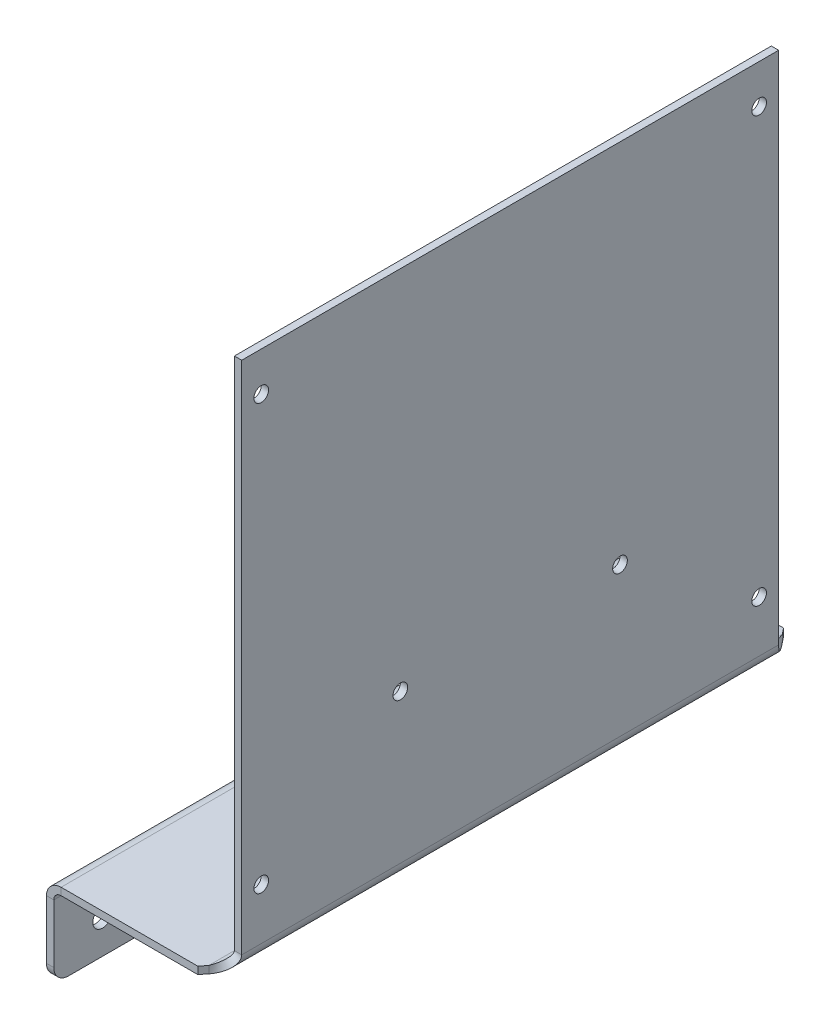
ISO-10303-21;
HEADER;
FILE_DESCRIPTION(('STEP AP214'),'2;1');
FILE_NAME('part.step','',(''),(''),'','','');
FILE_SCHEMA(('AUTOMOTIVE_DESIGN { 1 0 10303 214 1 1 1 1 }'));
ENDSEC;
DATA;
#1=APPLICATION_CONTEXT('core data for automotive mechanical design processes');
#2=APPLICATION_PROTOCOL_DEFINITION('international standard','automotive_design',2000,#1);
#3=PRODUCT_CONTEXT('',#1,'mechanical');
#4=PRODUCT('Part','Part','',(#3));
#5=PRODUCT_RELATED_PRODUCT_CATEGORY('part','',(#4));
#6=PRODUCT_DEFINITION_FORMATION('','',#4);
#7=PRODUCT_DEFINITION_CONTEXT('part definition',#1,'design');
#8=PRODUCT_DEFINITION('design','',#6,#7);
#9=PRODUCT_DEFINITION_SHAPE('','',#8);
#10=(LENGTH_UNIT() NAMED_UNIT(*) SI_UNIT(.MILLI.,.METRE.));
#11=(NAMED_UNIT(*) PLANE_ANGLE_UNIT() SI_UNIT($,.RADIAN.));
#12=(NAMED_UNIT(*) SI_UNIT($,.STERADIAN.) SOLID_ANGLE_UNIT());
#13=UNCERTAINTY_MEASURE_WITH_UNIT(LENGTH_MEASURE(1.E-05),#10,'distance_accuracy_value','');
#14=(GEOMETRIC_REPRESENTATION_CONTEXT(3) GLOBAL_UNCERTAINTY_ASSIGNED_CONTEXT((#13)) GLOBAL_UNIT_ASSIGNED_CONTEXT((#10,
#11,#12)) REPRESENTATION_CONTEXT('',''));
#15=CARTESIAN_POINT('',(0.,0.,0.));
#16=DIRECTION('',(0.,0.,1.));
#17=DIRECTION('',(1.,0.,0.));
#18=AXIS2_PLACEMENT_3D('',#15,#16,#17);
#19=CARTESIAN_POINT('',(-1.49999999999999,-105.5,60.));
#20=DIRECTION('',(0.,0.,1.));
#21=DIRECTION('',(1.,0.,0.));
#22=AXIS2_PLACEMENT_3D('',#19,#20,#21);
#23=PLANE('',#22);
#24=DIRECTION('',(-1.,0.,0.));
#25=VECTOR('',#24,1.);
#26=CARTESIAN_POINT('',(0.,-108.5,60.));
#27=LINE('',#26,#25);
#28=CARTESIAN_POINT('',(-4.,-108.5,60.));
#29=VERTEX_POINT('',#28);
#30=CARTESIAN_POINT('',(-32.,-108.5,60.));
#31=VERTEX_POINT('',#30);
#32=EDGE_CURVE('E300',#29,#31,#27,.T.);
#33=ORIENTED_EDGE('',*,*,#32,.F.);
#34=DIRECTION('',(0.,-1.,0.));
#35=VECTOR('',#34,1.);
#36=CARTESIAN_POINT('',(-4.,-108.5,60.));
#37=LINE('',#36,#35);
#38=CARTESIAN_POINT('',(-4.,-107.,60.));
#39=VERTEX_POINT('',#38);
#40=EDGE_CURVE('E346',#29,#39,#37,.F.);
#41=ORIENTED_EDGE('',*,*,#40,.T.);
#42=DIRECTION('',(1.,0.,0.));
#43=VECTOR('',#42,1.);
#44=CARTESIAN_POINT('',(0.,-107.,60.));
#45=LINE('',#44,#43);
#46=CARTESIAN_POINT('',(-32.,-107.,60.));
#47=VERTEX_POINT('',#46);
#48=EDGE_CURVE('E302',#39,#47,#45,.F.);
#49=ORIENTED_EDGE('',*,*,#48,.T.);
#50=DIRECTION('',(0.,-1.,0.));
#51=VECTOR('',#50,1.);
#52=CARTESIAN_POINT('',(-32.,-107.,60.));
#53=LINE('',#52,#51);
#54=EDGE_CURVE('E212',#47,#31,#53,.T.);
#55=ORIENTED_EDGE('',*,*,#54,.T.);
#56=EDGE_LOOP('',(#33,#41,#49,#55));
#57=FACE_BOUND('',#56,.T.);
#58=ADVANCED_FACE('F39',(#57),#23,.T.);
#59=CARTESIAN_POINT('',(-35.,-110.,-60.));
#60=DIRECTION('',(0.,0.,-1.));
#61=DIRECTION('',(-1.,0.,0.));
#62=AXIS2_PLACEMENT_3D('',#59,#60,#61);
#63=PLANE('',#62);
#64=DIRECTION('',(1.,0.,0.));
#65=VECTOR('',#64,1.);
#66=CARTESIAN_POINT('',(0.,-107.,-60.));
#67=LINE('',#66,#65);
#68=CARTESIAN_POINT('',(-4.00000000000002,-107.,-60.));
#69=VERTEX_POINT('',#68);
#70=CARTESIAN_POINT('',(-32.,-107.,-60.));
#71=VERTEX_POINT('',#70);
#72=EDGE_CURVE('E292',#69,#71,#67,.F.);
#73=ORIENTED_EDGE('',*,*,#72,.F.);
#74=DIRECTION('',(0.,-1.,0.));
#75=VECTOR('',#74,1.);
#76=CARTESIAN_POINT('',(-4.,-108.5,-60.));
#77=LINE('',#76,#75);
#78=CARTESIAN_POINT('',(-4.,-108.5,-60.));
#79=VERTEX_POINT('',#78);
#80=EDGE_CURVE('E307',#79,#69,#77,.F.);
#81=ORIENTED_EDGE('',*,*,#80,.F.);
#82=DIRECTION('',(-1.,0.,0.));
#83=VECTOR('',#82,1.);
#84=CARTESIAN_POINT('',(0.,-108.5,-60.));
#85=LINE('',#84,#83);
#86=CARTESIAN_POINT('',(-32.,-108.5,-60.));
#87=VERTEX_POINT('',#86);
#88=EDGE_CURVE('E310',#79,#87,#85,.T.);
#89=ORIENTED_EDGE('',*,*,#88,.T.);
#90=DIRECTION('',(0.,1.,0.));
#91=VECTOR('',#90,1.);
#92=CARTESIAN_POINT('',(-32.,-108.5,-60.));
#93=LINE('',#92,#91);
#94=EDGE_CURVE('E209',#87,#71,#93,.T.);
#95=ORIENTED_EDGE('',*,*,#94,.T.);
#96=EDGE_LOOP('',(#73,#81,#89,#95));
#97=FACE_BOUND('',#96,.T.);
#98=ADVANCED_FACE('F389',(#97),#63,.T.);
#99=CARTESIAN_POINT('',(0.,-108.5,60.));
#100=DIRECTION('',(0.,-1.,0.));
#101=DIRECTION('',(0.,0.,-1.));
#102=AXIS2_PLACEMENT_3D('',#99,#100,#101);
#103=PLANE('',#102);
#104=DIRECTION('',(0.,0.,-1.));
#105=VECTOR('',#104,1.);
#106=CARTESIAN_POINT('',(-2.99999999999999,-108.5,60.));
#107=LINE('',#106,#105);
#108=CARTESIAN_POINT('',(-2.99999999999999,-108.5,58.75));
#109=VERTEX_POINT('',#108);
#110=CARTESIAN_POINT('',(-2.99999999999999,-108.5,-58.75));
#111=VERTEX_POINT('',#110);
#112=EDGE_CURVE('E190',#109,#111,#107,.T.);
#113=ORIENTED_EDGE('',*,*,#112,.F.);
#114=DIRECTION('',(0.624695047554425,0.,-0.78086880944303));
#115=VECTOR('',#114,1.);
#116=CARTESIAN_POINT('',(-2.4390243902439,-108.5,58.0487804878049));
#117=LINE('',#116,#115);
#118=EDGE_CURVE('E347',#29,#109,#117,.T.);
#119=ORIENTED_EDGE('',*,*,#118,.F.);
#120=ORIENTED_EDGE('',*,*,#32,.T.);
#121=DIRECTION('',(0.,0.,-1.));
#122=VECTOR('',#121,1.);
#123=CARTESIAN_POINT('',(-32.,-108.5,60.));
#124=LINE('',#123,#122);
#125=EDGE_CURVE('E192',#31,#87,#124,.T.);
#126=ORIENTED_EDGE('',*,*,#125,.T.);
#127=ORIENTED_EDGE('',*,*,#88,.F.);
#128=DIRECTION('',(-0.624695047554425,0.,-0.78086880944303));
#129=VECTOR('',#128,1.);
#130=CARTESIAN_POINT('',(56.0975609756098,-108.5,15.1219512195122));
#131=LINE('',#130,#129);
#132=EDGE_CURVE('E337',#111,#79,#131,.T.);
#133=ORIENTED_EDGE('',*,*,#132,.F.);
#134=EDGE_LOOP('',(#113,#119,#120,#126,#127,#133));
#135=FACE_BOUND('',#134,.T.);
#136=ADVANCED_FACE('F384',(#135),#103,.T.);
#137=CARTESIAN_POINT('',(-2.99999999999999,-105.5,60.));
#138=DIRECTION('',(0.,0.,-1.));
#139=DIRECTION('',(-1.,0.,0.));
#140=AXIS2_PLACEMENT_3D('',#137,#138,#139);
#141=CYLINDRICAL_SURFACE('',#140,3.);
#142=DIRECTION('',(0.,0.,-1.));
#143=VECTOR('',#142,1.);
#144=CARTESIAN_POINT('',(0.,-105.5,60.));
#145=LINE('',#144,#143);
#146=CARTESIAN_POINT('',(0.,-105.5,55.));
#147=VERTEX_POINT('',#146);
#148=CARTESIAN_POINT('',(0.,-105.5,-55.));
#149=VERTEX_POINT('',#148);
#150=EDGE_CURVE('E183',#147,#149,#145,.T.);
#151=ORIENTED_EDGE('',*,*,#150,.F.);
#152=CARTESIAN_POINT('',(-2.99999999999999,-105.5,58.75));
#153=DIRECTION('',(-0.78086880944303,0.,-0.624695047554425));
#154=DIRECTION('',(0.624695047554425,0.,-0.78086880944303));
#155=AXIS2_PLACEMENT_3D('',#152,#153,#154);
#156=ELLIPSE('',#155,4.80234317807463,3.);
#157=EDGE_CURVE('E154',#109,#147,#156,.F.);
#158=ORIENTED_EDGE('',*,*,#157,.F.);
#159=ORIENTED_EDGE('',*,*,#112,.T.);
#160=CARTESIAN_POINT('',(-2.99999999999999,-105.5,-58.75));
#161=DIRECTION('',(-0.78086880944303,0.,0.624695047554425));
#162=DIRECTION('',(-0.624695047554425,0.,-0.78086880944303));
#163=AXIS2_PLACEMENT_3D('',#160,#161,#162);
#164=ELLIPSE('',#163,4.80234317807463,3.);
#165=EDGE_CURVE('E189',#149,#111,#164,.F.);
#166=ORIENTED_EDGE('',*,*,#165,.F.);
#167=EDGE_LOOP('',(#151,#158,#159,#166));
#168=FACE_BOUND('',#167,.T.);
#169=ADVANCED_FACE('F188',(#168),#141,.T.);
#170=CARTESIAN_POINT('',(0.,0.,60.));
#171=DIRECTION('',(1.,0.,0.));
#172=DIRECTION('',(0.,1.,0.));
#173=AXIS2_PLACEMENT_3D('',#170,#171,#172);
#174=PLANE('',#173);
#175=CARTESIAN_POINT('',(0.,-8.,51.));
#176=DIRECTION('',(1.,0.,0.));
#177=DIRECTION('',(0.,1.,0.));
#178=AXIS2_PLACEMENT_3D('',#175,#176,#177);
#179=CIRCLE('',#178,1.5);
#180=CARTESIAN_POINT('',(0.,-6.5,51.));
#181=VERTEX_POINT('',#180);
#182=EDGE_CURVE('E806',#181,#181,#179,.T.);
#183=ORIENTED_EDGE('',*,*,#182,.F.);
#184=EDGE_LOOP('',(#183));
#185=FACE_BOUND('',#184,.T.);
#186=CARTESIAN_POINT('',(0.,-75.,22.5));
#187=DIRECTION('',(1.,0.,0.));
#188=DIRECTION('',(0.,1.,0.));
#189=AXIS2_PLACEMENT_3D('',#186,#187,#188);
#190=CIRCLE('',#189,1.5);
#191=CARTESIAN_POINT('',(0.,-73.5,22.5));
#192=VERTEX_POINT('',#191);
#193=EDGE_CURVE('E802',#192,#192,#190,.T.);
#194=ORIENTED_EDGE('',*,*,#193,.F.);
#195=EDGE_LOOP('',(#194));
#196=FACE_BOUND('',#195,.T.);
#197=CARTESIAN_POINT('',(0.,-95.,51.));
#198=DIRECTION('',(1.,0.,0.));
#199=DIRECTION('',(0.,1.,0.));
#200=AXIS2_PLACEMENT_3D('',#197,#198,#199);
#201=CIRCLE('',#200,1.5);
#202=CARTESIAN_POINT('',(0.,-93.5,51.));
#203=VERTEX_POINT('',#202);
#204=EDGE_CURVE('E789',#203,#203,#201,.T.);
#205=ORIENTED_EDGE('',*,*,#204,.F.);
#206=EDGE_LOOP('',(#205));
#207=FACE_BOUND('',#206,.T.);
#208=CARTESIAN_POINT('',(0.,-95.,-51.));
#209=DIRECTION('',(1.,0.,0.));
#210=DIRECTION('',(0.,-1.,0.));
#211=AXIS2_PLACEMENT_3D('',#208,#209,#210);
#212=CIRCLE('',#211,1.5);
#213=CARTESIAN_POINT('',(0.,-96.5,-51.));
#214=VERTEX_POINT('',#213);
#215=EDGE_CURVE('E803',#214,#214,#212,.T.);
#216=ORIENTED_EDGE('',*,*,#215,.F.);
#217=EDGE_LOOP('',(#216));
#218=FACE_BOUND('',#217,.T.);
#219=CARTESIAN_POINT('',(0.,-75.,-22.5));
#220=DIRECTION('',(1.,0.,0.));
#221=DIRECTION('',(0.,-1.,0.));
#222=AXIS2_PLACEMENT_3D('',#219,#220,#221);
#223=CIRCLE('',#222,1.5);
#224=CARTESIAN_POINT('',(0.,-76.5,-22.5));
#225=VERTEX_POINT('',#224);
#226=EDGE_CURVE('E809',#225,#225,#223,.T.);
#227=ORIENTED_EDGE('',*,*,#226,.F.);
#228=EDGE_LOOP('',(#227));
#229=FACE_BOUND('',#228,.T.);
#230=CARTESIAN_POINT('',(0.,-8.,-51.));
#231=DIRECTION('',(1.,0.,0.));
#232=DIRECTION('',(0.,-1.,0.));
#233=AXIS2_PLACEMENT_3D('',#230,#231,#232);
#234=CIRCLE('',#233,1.5);
#235=CARTESIAN_POINT('',(0.,-9.50000000000001,-51.));
#236=VERTEX_POINT('',#235);
#237=EDGE_CURVE('E814',#236,#236,#234,.T.);
#238=ORIENTED_EDGE('',*,*,#237,.F.);
#239=EDGE_LOOP('',(#238));
#240=FACE_BOUND('',#239,.T.);
#241=DIRECTION('',(0.,0.,-1.));
#242=VECTOR('',#241,1.);
#243=CARTESIAN_POINT('',(0.,0.,60.));
#244=LINE('',#243,#242);
#245=CARTESIAN_POINT('',(0.,0.,55.));
#246=VERTEX_POINT('',#245);
#247=CARTESIAN_POINT('',(0.,0.,-55.));
#248=VERTEX_POINT('',#247);
#249=EDGE_CURVE('E185',#246,#248,#244,.T.);
#250=ORIENTED_EDGE('',*,*,#249,.F.);
#251=DIRECTION('',(0.,1.,0.));
#252=VECTOR('',#251,1.);
#253=CARTESIAN_POINT('',(0.,-125.,55.));
#254=LINE('',#253,#252);
#255=EDGE_CURVE('E172',#147,#246,#254,.T.);
#256=ORIENTED_EDGE('',*,*,#255,.F.);
#257=ORIENTED_EDGE('',*,*,#150,.T.);
#258=DIRECTION('',(0.,1.,0.));
#259=VECTOR('',#258,1.);
#260=CARTESIAN_POINT('',(0.,-125.,-55.));
#261=LINE('',#260,#259);
#262=EDGE_CURVE('E339',#149,#248,#261,.T.);
#263=ORIENTED_EDGE('',*,*,#262,.T.);
#264=EDGE_LOOP('',(#250,#256,#257,#263));
#265=FACE_BOUND('',#264,.T.);
#266=ADVANCED_FACE('F181',(#185,#196,#207,#218,#229,#240,#265),#174,.T.);
#267=CARTESIAN_POINT('',(-1.5,0.,60.));
#268=DIRECTION('',(0.,1.,0.));
#269=DIRECTION('',(-1.,0.,0.));
#270=AXIS2_PLACEMENT_3D('',#267,#268,#269);
#271=PLANE('',#270);
#272=DIRECTION('',(0.,0.,-1.));
#273=VECTOR('',#272,1.);
#274=CARTESIAN_POINT('',(-1.5,0.,60.));
#275=LINE('',#274,#273);
#276=CARTESIAN_POINT('',(-1.5,0.,55.));
#277=VERTEX_POINT('',#276);
#278=CARTESIAN_POINT('',(-1.5,0.,-55.));
#279=VERTEX_POINT('',#278);
#280=EDGE_CURVE('E194',#277,#279,#275,.T.);
#281=ORIENTED_EDGE('',*,*,#280,.F.);
#282=DIRECTION('',(1.,0.,0.));
#283=VECTOR('',#282,1.);
#284=CARTESIAN_POINT('',(0.,0.,55.));
#285=LINE('',#284,#283);
#286=EDGE_CURVE('E176',#246,#277,#285,.F.);
#287=ORIENTED_EDGE('',*,*,#286,.F.);
#288=ORIENTED_EDGE('',*,*,#249,.T.);
#289=DIRECTION('',(1.,0.,0.));
#290=VECTOR('',#289,1.);
#291=CARTESIAN_POINT('',(0.,0.,-55.));
#292=LINE('',#291,#290);
#293=EDGE_CURVE('E332',#248,#279,#292,.F.);
#294=ORIENTED_EDGE('',*,*,#293,.T.);
#295=EDGE_LOOP('',(#281,#287,#288,#294));
#296=FACE_BOUND('',#295,.T.);
#297=ADVANCED_FACE('F331',(#296),#271,.T.);
#298=CARTESIAN_POINT('',(-1.5,0.,60.));
#299=DIRECTION('',(1.,0.,0.));
#300=DIRECTION('',(0.,1.,0.));
#301=AXIS2_PLACEMENT_3D('',#298,#299,#300);
#302=PLANE('',#301);
#303=CARTESIAN_POINT('',(-1.5,-8.,51.));
#304=DIRECTION('',(1.,0.,0.));
#305=DIRECTION('',(0.,1.,0.));
#306=AXIS2_PLACEMENT_3D('',#303,#304,#305);
#307=CIRCLE('',#306,1.5);
#308=CARTESIAN_POINT('',(-1.5,-6.5,51.));
#309=VERTEX_POINT('',#308);
#310=EDGE_CURVE('E167',#309,#309,#307,.T.);
#311=ORIENTED_EDGE('',*,*,#310,.T.);
#312=EDGE_LOOP('',(#311));
#313=FACE_BOUND('',#312,.T.);
#314=CARTESIAN_POINT('',(-1.49999999999999,-75.,22.5));
#315=DIRECTION('',(1.,0.,0.));
#316=DIRECTION('',(0.,1.,0.));
#317=AXIS2_PLACEMENT_3D('',#314,#315,#316);
#318=CIRCLE('',#317,1.5);
#319=CARTESIAN_POINT('',(-1.49999999999999,-73.5,22.5));
#320=VERTEX_POINT('',#319);
#321=EDGE_CURVE('E240',#320,#320,#318,.T.);
#322=ORIENTED_EDGE('',*,*,#321,.T.);
#323=EDGE_LOOP('',(#322));
#324=FACE_BOUND('',#323,.T.);
#325=CARTESIAN_POINT('',(-1.49999999999999,-95.,51.));
#326=DIRECTION('',(1.,0.,0.));
#327=DIRECTION('',(0.,1.,0.));
#328=AXIS2_PLACEMENT_3D('',#325,#326,#327);
#329=CIRCLE('',#328,1.5);
#330=CARTESIAN_POINT('',(-1.49999999999999,-93.5,51.));
#331=VERTEX_POINT('',#330);
#332=EDGE_CURVE('E237',#331,#331,#329,.T.);
#333=ORIENTED_EDGE('',*,*,#332,.T.);
#334=EDGE_LOOP('',(#333));
#335=FACE_BOUND('',#334,.T.);
#336=CARTESIAN_POINT('',(-1.49999999999999,-95.,-51.));
#337=DIRECTION('',(1.,0.,0.));
#338=DIRECTION('',(0.,1.,0.));
#339=AXIS2_PLACEMENT_3D('',#336,#337,#338);
#340=CIRCLE('',#339,1.5);
#341=CARTESIAN_POINT('',(-1.49999999999999,-93.5,-51.));
#342=VERTEX_POINT('',#341);
#343=EDGE_CURVE('E234',#342,#342,#340,.T.);
#344=ORIENTED_EDGE('',*,*,#343,.T.);
#345=EDGE_LOOP('',(#344));
#346=FACE_BOUND('',#345,.T.);
#347=CARTESIAN_POINT('',(-1.49999999999999,-75.,-22.5));
#348=DIRECTION('',(1.,0.,0.));
#349=DIRECTION('',(0.,1.,0.));
#350=AXIS2_PLACEMENT_3D('',#347,#348,#349);
#351=CIRCLE('',#350,1.5);
#352=CARTESIAN_POINT('',(-1.49999999999999,-73.5,-22.5));
#353=VERTEX_POINT('',#352);
#354=EDGE_CURVE('E231',#353,#353,#351,.T.);
#355=ORIENTED_EDGE('',*,*,#354,.T.);
#356=EDGE_LOOP('',(#355));
#357=FACE_BOUND('',#356,.T.);
#358=CARTESIAN_POINT('',(-1.5,-8.,-51.));
#359=DIRECTION('',(1.,0.,0.));
#360=DIRECTION('',(0.,1.,0.));
#361=AXIS2_PLACEMENT_3D('',#358,#359,#360);
#362=CIRCLE('',#361,1.5);
#363=CARTESIAN_POINT('',(-1.5,-6.5,-51.));
#364=VERTEX_POINT('',#363);
#365=EDGE_CURVE('E228',#364,#364,#362,.T.);
#366=ORIENTED_EDGE('',*,*,#365,.T.);
#367=EDGE_LOOP('',(#366));
#368=FACE_BOUND('',#367,.T.);
#369=DIRECTION('',(0.,1.,0.));
#370=VECTOR('',#369,1.);
#371=CARTESIAN_POINT('',(-1.5,0.,55.));
#372=LINE('',#371,#370);
#373=CARTESIAN_POINT('',(-1.49999999999999,-105.5,55.));
#374=VERTEX_POINT('',#373);
#375=EDGE_CURVE('E175',#374,#277,#372,.T.);
#376=ORIENTED_EDGE('',*,*,#375,.T.);
#377=ORIENTED_EDGE('',*,*,#280,.T.);
#378=DIRECTION('',(0.,1.,0.));
#379=VECTOR('',#378,1.);
#380=CARTESIAN_POINT('',(-1.5,0.,-55.));
#381=LINE('',#380,#379);
#382=CARTESIAN_POINT('',(-1.49999999999999,-105.5,-55.));
#383=VERTEX_POINT('',#382);
#384=EDGE_CURVE('E328',#383,#279,#381,.T.);
#385=ORIENTED_EDGE('',*,*,#384,.F.);
#386=DIRECTION('',(0.,0.,-1.));
#387=VECTOR('',#386,1.);
#388=CARTESIAN_POINT('',(-1.49999999999999,-105.5,60.));
#389=LINE('',#388,#387);
#390=EDGE_CURVE('E320',#374,#383,#389,.T.);
#391=ORIENTED_EDGE('',*,*,#390,.F.);
#392=EDGE_LOOP('',(#376,#377,#385,#391));
#393=FACE_BOUND('',#392,.T.);
#394=ADVANCED_FACE('F326',(#313,#324,#335,#346,#357,#368,#393),#302,.F.);
#395=CARTESIAN_POINT('',(-2.99999999999999,-105.5,60.));
#396=DIRECTION('',(0.,0.,-1.));
#397=DIRECTION('',(-1.,0.,0.));
#398=AXIS2_PLACEMENT_3D('',#395,#396,#397);
#399=CYLINDRICAL_SURFACE('',#398,1.5);
#400=CARTESIAN_POINT('',(-2.99999999999999,-105.5,58.75));
#401=DIRECTION('',(-0.928476690885259,0.,-0.371390676354104));
#402=DIRECTION('',(0.371390676354104,0.,-0.928476690885259));
#403=AXIS2_PLACEMENT_3D('',#400,#401,#402);
#404=ELLIPSE('',#403,4.03887360535087,1.5);
#405=CARTESIAN_POINT('',(-2.99999999999999,-107.,58.75));
#406=VERTEX_POINT('',#405);
#407=EDGE_CURVE('E166',#406,#374,#404,.F.);
#408=ORIENTED_EDGE('',*,*,#407,.T.);
#409=ORIENTED_EDGE('',*,*,#390,.T.);
#410=CARTESIAN_POINT('',(-2.99999999999999,-105.5,-58.75));
#411=DIRECTION('',(-0.928476690885259,0.,0.371390676354105));
#412=DIRECTION('',(-0.371390676354105,0.,-0.928476690885259));
#413=AXIS2_PLACEMENT_3D('',#410,#411,#412);
#414=ELLIPSE('',#413,4.03887360535087,1.5);
#415=CARTESIAN_POINT('',(-2.99999999999999,-107.,-58.75));
#416=VERTEX_POINT('',#415);
#417=EDGE_CURVE('E365',#383,#416,#414,.F.);
#418=ORIENTED_EDGE('',*,*,#417,.T.);
#419=DIRECTION('',(0.,0.,-1.));
#420=VECTOR('',#419,1.);
#421=CARTESIAN_POINT('',(-2.99999999999999,-107.,60.));
#422=LINE('',#421,#420);
#423=EDGE_CURVE('E317',#406,#416,#422,.T.);
#424=ORIENTED_EDGE('',*,*,#423,.F.);
#425=EDGE_LOOP('',(#408,#409,#418,#424));
#426=FACE_BOUND('',#425,.T.);
#427=ADVANCED_FACE('F369',(#426),#399,.F.);
#428=CARTESIAN_POINT('',(0.,-107.,60.));
#429=DIRECTION('',(0.,-1.,0.));
#430=DIRECTION('',(0.,0.,-1.));
#431=AXIS2_PLACEMENT_3D('',#428,#429,#430);
#432=PLANE('',#431);
#433=DIRECTION('',(0.624695047554425,0.,-0.78086880944303));
#434=VECTOR('',#433,1.);
#435=CARTESIAN_POINT('',(-2.4390243902439,-107.,58.0487804878049));
#436=LINE('',#435,#434);
#437=EDGE_CURVE('E343',#39,#406,#436,.T.);
#438=ORIENTED_EDGE('',*,*,#437,.T.);
#439=ORIENTED_EDGE('',*,*,#423,.T.);
#440=DIRECTION('',(-0.624695047554425,0.,-0.78086880944303));
#441=VECTOR('',#440,1.);
#442=CARTESIAN_POINT('',(56.0975609756098,-107.,15.1219512195122));
#443=LINE('',#442,#441);
#444=EDGE_CURVE('E354',#416,#69,#443,.T.);
#445=ORIENTED_EDGE('',*,*,#444,.T.);
#446=ORIENTED_EDGE('',*,*,#72,.T.);
#447=DIRECTION('',(0.,0.,-1.));
#448=VECTOR('',#447,1.);
#449=CARTESIAN_POINT('',(-32.,-107.,60.));
#450=LINE('',#449,#448);
#451=EDGE_CURVE('E314',#47,#71,#450,.T.);
#452=ORIENTED_EDGE('',*,*,#451,.F.);
#453=ORIENTED_EDGE('',*,*,#48,.F.);
#454=EDGE_LOOP('',(#438,#439,#445,#446,#452,#453));
#455=FACE_BOUND('',#454,.T.);
#456=ADVANCED_FACE('F372',(#455),#432,.F.);
#457=CARTESIAN_POINT('',(-33.5,-110.,60.));
#458=DIRECTION('',(0.,0.,1.));
#459=DIRECTION('',(1.,0.,0.));
#460=AXIS2_PLACEMENT_3D('',#457,#458,#459);
#461=PLANE('',#460);
#462=DIRECTION('',(-1.,0.,0.));
#463=VECTOR('',#462,1.);
#464=CARTESIAN_POINT('',(-33.5,-110.,60.));
#465=LINE('',#464,#463);
#466=CARTESIAN_POINT('',(-33.5,-110.,60.));
#467=VERTEX_POINT('',#466);
#468=CARTESIAN_POINT('',(-35.,-110.,60.));
#469=VERTEX_POINT('',#468);
#470=EDGE_CURVE('E215',#467,#469,#465,.T.);
#471=ORIENTED_EDGE('',*,*,#470,.F.);
#472=CARTESIAN_POINT('',(-32.,-110.,60.));
#473=DIRECTION('',(0.,0.,-1.));
#474=DIRECTION('',(-1.,0.,0.));
#475=AXIS2_PLACEMENT_3D('',#472,#473,#474);
#476=CIRCLE('',#475,1.5);
#477=EDGE_CURVE('E289',#31,#467,#476,.F.);
#478=ORIENTED_EDGE('',*,*,#477,.F.);
#479=ORIENTED_EDGE('',*,*,#54,.F.);
#480=CARTESIAN_POINT('',(-32.,-110.,60.));
#481=DIRECTION('',(0.,0.,1.));
#482=DIRECTION('',(1.,0.,0.));
#483=AXIS2_PLACEMENT_3D('',#480,#481,#482);
#484=CIRCLE('',#483,3.);
#485=EDGE_CURVE('E304',#47,#469,#484,.T.);
#486=ORIENTED_EDGE('',*,*,#485,.T.);
#487=EDGE_LOOP('',(#471,#478,#479,#486));
#488=FACE_BOUND('',#487,.T.);
#489=ADVANCED_FACE('F397',(#488),#461,.T.);
#490=CARTESIAN_POINT('',(-32.,-107.,60.));
#491=DIRECTION('',(0.,0.,1.));
#492=DIRECTION('',(1.,0.,0.));
#493=AXIS2_PLACEMENT_3D('',#490,#491,#492);
#494=PLANE('',#493);
#495=DIRECTION('',(0.,-1.,0.));
#496=VECTOR('',#495,1.);
#497=CARTESIAN_POINT('',(-35.,-108.5,60.));
#498=LINE('',#497,#496);
#499=CARTESIAN_POINT('',(-35.,-122.,60.));
#500=VERTEX_POINT('',#499);
#501=EDGE_CURVE('E283',#469,#500,#498,.T.);
#502=ORIENTED_EDGE('',*,*,#501,.T.);
#503=DIRECTION('',(-1.,0.,0.));
#504=VECTOR('',#503,1.);
#505=CARTESIAN_POINT('',(-32.,-122.,60.));
#506=LINE('',#505,#504);
#507=CARTESIAN_POINT('',(-33.5,-122.,60.));
#508=VERTEX_POINT('',#507);
#509=EDGE_CURVE('E11',#500,#508,#506,.F.);
#510=ORIENTED_EDGE('',*,*,#509,.T.);
#511=DIRECTION('',(0.,-1.,0.));
#512=VECTOR('',#511,1.);
#513=CARTESIAN_POINT('',(-33.5,-108.5,60.));
#514=LINE('',#513,#512);
#515=EDGE_CURVE('E286',#467,#508,#514,.T.);
#516=ORIENTED_EDGE('',*,*,#515,.F.);
#517=ORIENTED_EDGE('',*,*,#470,.T.);
#518=EDGE_LOOP('',(#502,#510,#516,#517));
#519=FACE_BOUND('',#518,.T.);
#520=ADVANCED_FACE('F284',(#519),#494,.T.);
#521=CARTESIAN_POINT('',(-32.,-108.5,-60.));
#522=DIRECTION('',(0.,0.,-1.));
#523=DIRECTION('',(-1.,0.,0.));
#524=AXIS2_PLACEMENT_3D('',#521,#522,#523);
#525=PLANE('',#524);
#526=ORIENTED_EDGE('',*,*,#94,.F.);
#527=CARTESIAN_POINT('',(-32.,-110.,-60.));
#528=DIRECTION('',(0.,0.,-1.));
#529=DIRECTION('',(-1.,0.,0.));
#530=AXIS2_PLACEMENT_3D('',#527,#528,#529);
#531=CIRCLE('',#530,1.5);
#532=CARTESIAN_POINT('',(-33.5,-110.,-60.));
#533=VERTEX_POINT('',#532);
#534=EDGE_CURVE('E270',#87,#533,#531,.F.);
#535=ORIENTED_EDGE('',*,*,#534,.T.);
#536=DIRECTION('',(1.,0.,0.));
#537=VECTOR('',#536,1.);
#538=CARTESIAN_POINT('',(-35.,-110.,-60.));
#539=LINE('',#538,#537);
#540=CARTESIAN_POINT('',(-35.,-110.,-60.));
#541=VERTEX_POINT('',#540);
#542=EDGE_CURVE('E207',#541,#533,#539,.T.);
#543=ORIENTED_EDGE('',*,*,#542,.F.);
#544=CARTESIAN_POINT('',(-32.,-110.,-60.));
#545=DIRECTION('',(0.,0.,1.));
#546=DIRECTION('',(1.,0.,0.));
#547=AXIS2_PLACEMENT_3D('',#544,#545,#546);
#548=CIRCLE('',#547,3.);
#549=EDGE_CURVE('E287',#71,#541,#548,.T.);
#550=ORIENTED_EDGE('',*,*,#549,.F.);
#551=EDGE_LOOP('',(#526,#535,#543,#550));
#552=FACE_BOUND('',#551,.T.);
#553=ADVANCED_FACE('F402',(#552),#525,.T.);
#554=CARTESIAN_POINT('',(-35.,-108.5,60.));
#555=DIRECTION('',(1.,0.,0.));
#556=DIRECTION('',(0.,1.,0.));
#557=AXIS2_PLACEMENT_3D('',#554,#555,#556);
#558=PLANE('',#557);
#559=CARTESIAN_POINT('',(-35.,-118.,-50.));
#560=DIRECTION('',(1.,0.,0.));
#561=DIRECTION('',(0.,-1.,0.));
#562=AXIS2_PLACEMENT_3D('',#559,#560,#561);
#563=CIRCLE('',#562,2.);
#564=CARTESIAN_POINT('',(-35.,-120.,-50.));
#565=VERTEX_POINT('',#564);
#566=EDGE_CURVE('E817',#565,#565,#563,.T.);
#567=ORIENTED_EDGE('',*,*,#566,.T.);
#568=EDGE_LOOP('',(#567));
#569=FACE_BOUND('',#568,.T.);
#570=CARTESIAN_POINT('',(-35.,-118.,0.));
#571=DIRECTION('',(1.,0.,0.));
#572=DIRECTION('',(0.,1.,0.));
#573=AXIS2_PLACEMENT_3D('',#570,#571,#572);
#574=CIRCLE('',#573,1.5);
#575=CARTESIAN_POINT('',(-35.,-116.5,0.));
#576=VERTEX_POINT('',#575);
#577=EDGE_CURVE('E820',#576,#576,#574,.T.);
#578=ORIENTED_EDGE('',*,*,#577,.T.);
#579=EDGE_LOOP('',(#578));
#580=FACE_BOUND('',#579,.T.);
#581=CARTESIAN_POINT('',(-35.,-118.,50.));
#582=DIRECTION('',(1.,0.,0.));
#583=DIRECTION('',(0.,1.,0.));
#584=AXIS2_PLACEMENT_3D('',#581,#582,#583);
#585=CIRCLE('',#584,2.);
#586=CARTESIAN_POINT('',(-35.,-116.,50.));
#587=VERTEX_POINT('',#586);
#588=EDGE_CURVE('E222',#587,#587,#585,.T.);
#589=ORIENTED_EDGE('',*,*,#588,.T.);
#590=EDGE_LOOP('',(#589));
#591=FACE_BOUND('',#590,.T.);
#592=DIRECTION('',(0.,-1.,0.));
#593=VECTOR('',#592,1.);
#594=CARTESIAN_POINT('',(-35.,-108.5,-60.));
#595=LINE('',#594,#593);
#596=CARTESIAN_POINT('',(-35.,-122.,-60.));
#597=VERTEX_POINT('',#596);
#598=EDGE_CURVE('E271',#541,#597,#595,.T.);
#599=ORIENTED_EDGE('',*,*,#598,.T.);
#600=CARTESIAN_POINT('',(-35.,-122.,-57.));
#601=DIRECTION('',(1.,0.,0.));
#602=DIRECTION('',(0.,1.,0.));
#603=AXIS2_PLACEMENT_3D('',#600,#601,#602);
#604=CIRCLE('',#603,3.);
#605=CARTESIAN_POINT('',(-35.,-125.,-57.));
#606=VERTEX_POINT('',#605);
#607=EDGE_CURVE('E249',#597,#606,#604,.F.);
#608=ORIENTED_EDGE('',*,*,#607,.T.);
#609=DIRECTION('',(0.,0.,-1.));
#610=VECTOR('',#609,1.);
#611=CARTESIAN_POINT('',(-35.,-125.,60.));
#612=LINE('',#611,#610);
#613=CARTESIAN_POINT('',(-35.,-125.,57.));
#614=VERTEX_POINT('',#613);
#615=EDGE_CURVE('E205',#614,#606,#612,.T.);
#616=ORIENTED_EDGE('',*,*,#615,.F.);
#617=CARTESIAN_POINT('',(-35.,-122.,57.));
#618=DIRECTION('',(1.,0.,0.));
#619=DIRECTION('',(0.,1.,0.));
#620=AXIS2_PLACEMENT_3D('',#617,#618,#619);
#621=CIRCLE('',#620,3.);
#622=EDGE_CURVE('E247',#614,#500,#621,.F.);
#623=ORIENTED_EDGE('',*,*,#622,.T.);
#624=ORIENTED_EDGE('',*,*,#501,.F.);
#625=DIRECTION('',(0.,0.,-1.));
#626=VECTOR('',#625,1.);
#627=CARTESIAN_POINT('',(-35.,-110.,60.));
#628=LINE('',#627,#626);
#629=EDGE_CURVE('E306',#469,#541,#628,.T.);
#630=ORIENTED_EDGE('',*,*,#629,.T.);
#631=EDGE_LOOP('',(#599,#608,#616,#623,#624,#630));
#632=FACE_BOUND('',#631,.T.);
#633=ADVANCED_FACE('F276',(#569,#580,#591,#632),#558,.F.);
#634=CARTESIAN_POINT('',(-33.5,-125.,60.));
#635=DIRECTION('',(0.,-1.,0.));
#636=DIRECTION('',(0.,0.,-1.));
#637=AXIS2_PLACEMENT_3D('',#634,#635,#636);
#638=PLANE('',#637);
#639=ORIENTED_EDGE('',*,*,#615,.T.);
#640=DIRECTION('',(-1.,0.,0.));
#641=VECTOR('',#640,1.);
#642=CARTESIAN_POINT('',(-33.5,-125.,-57.));
#643=LINE('',#642,#641);
#644=CARTESIAN_POINT('',(-33.5,-125.,-57.));
#645=VERTEX_POINT('',#644);
#646=EDGE_CURVE('E60',#606,#645,#643,.F.);
#647=ORIENTED_EDGE('',*,*,#646,.T.);
#648=DIRECTION('',(0.,0.,-1.));
#649=VECTOR('',#648,1.);
#650=CARTESIAN_POINT('',(-33.5,-125.,60.));
#651=LINE('',#650,#649);
#652=CARTESIAN_POINT('',(-33.5,-125.,57.));
#653=VERTEX_POINT('',#652);
#654=EDGE_CURVE('E203',#653,#645,#651,.T.);
#655=ORIENTED_EDGE('',*,*,#654,.F.);
#656=DIRECTION('',(-1.,0.,0.));
#657=VECTOR('',#656,1.);
#658=CARTESIAN_POINT('',(-33.5,-125.,57.));
#659=LINE('',#658,#657);
#660=EDGE_CURVE('E251',#653,#614,#659,.T.);
#661=ORIENTED_EDGE('',*,*,#660,.T.);
#662=EDGE_LOOP('',(#639,#647,#655,#661));
#663=FACE_BOUND('',#662,.T.);
#664=ADVANCED_FACE('F278',(#663),#638,.T.);
#665=CARTESIAN_POINT('',(-33.5,-108.5,60.));
#666=DIRECTION('',(1.,0.,0.));
#667=DIRECTION('',(0.,1.,0.));
#668=AXIS2_PLACEMENT_3D('',#665,#666,#667);
#669=PLANE('',#668);
#670=CARTESIAN_POINT('',(-33.5,-118.,-50.));
#671=DIRECTION('',(1.,0.,0.));
#672=DIRECTION('',(0.,1.,0.));
#673=AXIS2_PLACEMENT_3D('',#670,#671,#672);
#674=CIRCLE('',#673,2.);
#675=CARTESIAN_POINT('',(-33.5,-116.,-50.));
#676=VERTEX_POINT('',#675);
#677=EDGE_CURVE('E225',#676,#676,#674,.T.);
#678=ORIENTED_EDGE('',*,*,#677,.F.);
#679=EDGE_LOOP('',(#678));
#680=FACE_BOUND('',#679,.T.);
#681=CARTESIAN_POINT('',(-33.5,-118.,0.));
#682=DIRECTION('',(1.,0.,0.));
#683=DIRECTION('',(0.,1.,0.));
#684=AXIS2_PLACEMENT_3D('',#681,#682,#683);
#685=CIRCLE('',#684,1.5);
#686=CARTESIAN_POINT('',(-33.5,-116.5,0.));
#687=VERTEX_POINT('',#686);
#688=EDGE_CURVE('E221',#687,#687,#685,.T.);
#689=ORIENTED_EDGE('',*,*,#688,.F.);
#690=EDGE_LOOP('',(#689));
#691=FACE_BOUND('',#690,.T.);
#692=CARTESIAN_POINT('',(-33.5,-118.,50.));
#693=DIRECTION('',(1.,0.,0.));
#694=DIRECTION('',(0.,1.,0.));
#695=AXIS2_PLACEMENT_3D('',#692,#693,#694);
#696=CIRCLE('',#695,2.);
#697=CARTESIAN_POINT('',(-33.5,-116.,50.));
#698=VERTEX_POINT('',#697);
#699=EDGE_CURVE('E218',#698,#698,#696,.T.);
#700=ORIENTED_EDGE('',*,*,#699,.F.);
#701=EDGE_LOOP('',(#700));
#702=FACE_BOUND('',#701,.T.);
#703=ORIENTED_EDGE('',*,*,#654,.T.);
#704=CARTESIAN_POINT('',(-33.5,-122.,-57.));
#705=DIRECTION('',(1.,0.,0.));
#706=DIRECTION('',(0.,1.,0.));
#707=AXIS2_PLACEMENT_3D('',#704,#705,#706);
#708=CIRCLE('',#707,3.);
#709=CARTESIAN_POINT('',(-33.5,-122.,-60.));
#710=VERTEX_POINT('',#709);
#711=EDGE_CURVE('E47',#645,#710,#708,.T.);
#712=ORIENTED_EDGE('',*,*,#711,.T.);
#713=DIRECTION('',(0.,-1.,0.));
#714=VECTOR('',#713,1.);
#715=CARTESIAN_POINT('',(-33.5,-108.5,-60.));
#716=LINE('',#715,#714);
#717=EDGE_CURVE('E262',#533,#710,#716,.T.);
#718=ORIENTED_EDGE('',*,*,#717,.F.);
#719=DIRECTION('',(0.,0.,-1.));
#720=VECTOR('',#719,1.);
#721=CARTESIAN_POINT('',(-33.5,-110.,60.));
#722=LINE('',#721,#720);
#723=EDGE_CURVE('E200',#467,#533,#722,.T.);
#724=ORIENTED_EDGE('',*,*,#723,.F.);
#725=ORIENTED_EDGE('',*,*,#515,.T.);
#726=CARTESIAN_POINT('',(-33.5,-122.,57.));
#727=DIRECTION('',(1.,0.,0.));
#728=DIRECTION('',(0.,1.,0.));
#729=AXIS2_PLACEMENT_3D('',#726,#727,#728);
#730=CIRCLE('',#729,3.);
#731=EDGE_CURVE('E255',#508,#653,#730,.T.);
#732=ORIENTED_EDGE('',*,*,#731,.T.);
#733=EDGE_LOOP('',(#703,#712,#718,#724,#725,#732));
#734=FACE_BOUND('',#733,.T.);
#735=ADVANCED_FACE('F260',(#680,#691,#702,#734),#669,.T.);
#736=CARTESIAN_POINT('',(-32.,-110.,60.));
#737=DIRECTION('',(0.,0.,-1.));
#738=DIRECTION('',(-1.,0.,0.));
#739=AXIS2_PLACEMENT_3D('',#736,#737,#738);
#740=CYLINDRICAL_SURFACE('',#739,1.5);
#741=ORIENTED_EDGE('',*,*,#534,.F.);
#742=ORIENTED_EDGE('',*,*,#125,.F.);
#743=ORIENTED_EDGE('',*,*,#477,.T.);
#744=ORIENTED_EDGE('',*,*,#723,.T.);
#745=EDGE_LOOP('',(#741,#742,#743,#744));
#746=FACE_BOUND('',#745,.T.);
#747=ADVANCED_FACE('F400',(#746),#740,.F.);
#748=CARTESIAN_POINT('',(-32.,-110.,60.));
#749=DIRECTION('',(0.,0.,-1.));
#750=DIRECTION('',(-1.,0.,0.));
#751=AXIS2_PLACEMENT_3D('',#748,#749,#750);
#752=CYLINDRICAL_SURFACE('',#751,3.);
#753=ORIENTED_EDGE('',*,*,#549,.T.);
#754=ORIENTED_EDGE('',*,*,#629,.F.);
#755=ORIENTED_EDGE('',*,*,#485,.F.);
#756=ORIENTED_EDGE('',*,*,#451,.T.);
#757=EDGE_LOOP('',(#753,#754,#755,#756));
#758=FACE_BOUND('',#757,.T.);
#759=ADVANCED_FACE('F395',(#758),#752,.T.);
#760=CARTESIAN_POINT('',(-32.,-110.,-60.));
#761=DIRECTION('',(0.,0.,-1.));
#762=DIRECTION('',(-1.,0.,0.));
#763=AXIS2_PLACEMENT_3D('',#760,#761,#762);
#764=PLANE('',#763);
#765=ORIENTED_EDGE('',*,*,#717,.T.);
#766=DIRECTION('',(-1.,0.,0.));
#767=VECTOR('',#766,1.);
#768=CARTESIAN_POINT('',(-32.,-122.,-60.));
#769=LINE('',#768,#767);
#770=EDGE_CURVE('E217',#710,#597,#769,.T.);
#771=ORIENTED_EDGE('',*,*,#770,.T.);
#772=ORIENTED_EDGE('',*,*,#598,.F.);
#773=ORIENTED_EDGE('',*,*,#542,.T.);
#774=EDGE_LOOP('',(#765,#771,#772,#773));
#775=FACE_BOUND('',#774,.T.);
#776=ADVANCED_FACE('F267',(#775),#764,.T.);
#777=CARTESIAN_POINT('',(56.0975609756098,-108.5,15.1219512195122));
#778=DIRECTION('',(-0.78086880944303,0.,0.624695047554425));
#779=DIRECTION('',(-0.624695047554425,0.,-0.78086880944303));
#780=AXIS2_PLACEMENT_3D('',#777,#778,#779);
#781=PLANE('',#780);
#782=ORIENTED_EDGE('',*,*,#132,.T.);
#783=ORIENTED_EDGE('',*,*,#80,.T.);
#784=ORIENTED_EDGE('',*,*,#444,.F.);
#785=DIRECTION('',(0.,-1.,0.));
#786=VECTOR('',#785,1.);
#787=CARTESIAN_POINT('',(-2.99999999999999,-108.5,-58.75));
#788=LINE('',#787,#786);
#789=EDGE_CURVE('E295',#111,#416,#788,.F.);
#790=ORIENTED_EDGE('',*,*,#789,.F.);
#791=EDGE_LOOP('',(#782,#783,#784,#790));
#792=FACE_BOUND('',#791,.T.);
#793=ADVANCED_FACE('F387',(#792),#781,.F.);
#794=CARTESIAN_POINT('',(0.,-125.,-55.));
#795=DIRECTION('',(0.,0.,-1.));
#796=DIRECTION('',(0.,1.,0.));
#797=AXIS2_PLACEMENT_3D('',#794,#795,#796);
#798=PLANE('',#797);
#799=ORIENTED_EDGE('',*,*,#262,.F.);
#800=DIRECTION('',(1.,0.,0.));
#801=VECTOR('',#800,1.);
#802=CARTESIAN_POINT('',(0.,-105.5,-55.));
#803=LINE('',#802,#801);
#804=EDGE_CURVE('E334',#149,#383,#803,.F.);
#805=ORIENTED_EDGE('',*,*,#804,.T.);
#806=ORIENTED_EDGE('',*,*,#384,.T.);
#807=ORIENTED_EDGE('',*,*,#293,.F.);
#808=EDGE_LOOP('',(#799,#805,#806,#807));
#809=FACE_BOUND('',#808,.T.);
#810=ADVANCED_FACE('F457',(#809),#798,.T.);
#811=CARTESIAN_POINT('',(-5.99999999999999,-105.5,-62.5));
#812=CARTESIAN_POINT('',(-5.49999999999999,-105.5,-62.5));
#813=CARTESIAN_POINT('',(-4.99999999999999,-105.5,-62.5));
#814=CARTESIAN_POINT('',(-4.49999999999999,-105.5,-62.5));
#815=CARTESIAN_POINT('',(-5.99999999999999,-99.5,-62.5));
#816=CARTESIAN_POINT('',(-5.49999999999999,-100.5,-62.5));
#817=CARTESIAN_POINT('',(-4.99999999999999,-101.5,-62.5));
#818=CARTESIAN_POINT('',(-4.49999999999999,-102.5,-62.5));
#819=CARTESIAN_POINT('',(0.,-99.5,-55.));
#820=CARTESIAN_POINT('',(-0.499999999999986,-100.5,-55.));
#821=CARTESIAN_POINT('',(-0.999999999999987,-101.5,-55.));
#822=CARTESIAN_POINT('',(-1.49999999999999,-102.5,-55.));
#823=CARTESIAN_POINT('',(0.,-105.5,-55.));
#824=CARTESIAN_POINT('',(-0.499999999999987,-105.5,-55.));
#825=CARTESIAN_POINT('',(-0.999999999999987,-105.5,-55.));
#826=CARTESIAN_POINT('',(-1.49999999999999,-105.5,-55.));
#827=CARTESIAN_POINT('',(0.,-111.5,-55.));
#828=CARTESIAN_POINT('',(-0.499999999999988,-110.5,-55.));
#829=CARTESIAN_POINT('',(-0.999999999999988,-109.5,-55.));
#830=CARTESIAN_POINT('',(-1.49999999999999,-108.5,-55.));
#831=CARTESIAN_POINT('',(-5.99999999999999,-111.5,-62.5));
#832=CARTESIAN_POINT('',(-5.49999999999999,-110.5,-62.5));
#833=CARTESIAN_POINT('',(-4.99999999999999,-109.5,-62.5));
#834=CARTESIAN_POINT('',(-4.49999999999999,-108.5,-62.5));
#835=CARTESIAN_POINT('',(-5.99999999999999,-105.5,-62.5));
#836=CARTESIAN_POINT('',(-5.49999999999999,-105.5,-62.5));
#837=CARTESIAN_POINT('',(-4.99999999999999,-105.5,-62.5));
#838=CARTESIAN_POINT('',(-4.49999999999999,-105.5,-62.5));
#839=(BOUNDED_SURFACE() B_SPLINE_SURFACE(3,3,((#811,#812,#813,#814),(#815,#816,#817,#818),(#819,
#820,#821,#822),(#823,#824,#825,#826),(#827,#828,#829,#830),(#831,#832,#833,#834),(#835,#836,
#837,#838)),.UNSPECIFIED.,.T.,.F.,.F.) B_SPLINE_SURFACE_WITH_KNOTS((4,3,4),(4,4),(0.,0.5,1.),
(0.,1.),.UNSPECIFIED.) GEOMETRIC_REPRESENTATION_ITEM() RATIONAL_B_SPLINE_SURFACE(((1.,1.,1.,1.),
(0.333333333333333,0.333333333333333,0.333333333333333,0.333333333333333),(0.333333333333333,
0.333333333333333,0.333333333333333,0.333333333333333),(1.,1.,1.,1.),(0.333333333333333,
0.333333333333333,0.333333333333333,0.333333333333333),(0.333333333333333,0.333333333333333,
0.333333333333333,0.333333333333333),(1.,1.,1.,1.))) REPRESENTATION_ITEM('') SURFACE());
#840=ORIENTED_EDGE('',*,*,#165,.T.);
#841=ORIENTED_EDGE('',*,*,#789,.T.);
#842=ORIENTED_EDGE('',*,*,#417,.F.);
#843=ORIENTED_EDGE('',*,*,#804,.F.);
#844=EDGE_LOOP('',(#840,#841,#842,#843));
#845=FACE_BOUND('',#844,.T.);
#846=ADVANCED_FACE('F363',(#845),#839,.T.);
#847=CARTESIAN_POINT('',(0.,-125.,55.));
#848=DIRECTION('',(0.,0.,-1.));
#849=DIRECTION('',(0.,1.,0.));
#850=AXIS2_PLACEMENT_3D('',#847,#848,#849);
#851=PLANE('',#850);
#852=ORIENTED_EDGE('',*,*,#255,.T.);
#853=ORIENTED_EDGE('',*,*,#286,.T.);
#854=ORIENTED_EDGE('',*,*,#375,.F.);
#855=DIRECTION('',(1.,0.,0.));
#856=VECTOR('',#855,1.);
#857=CARTESIAN_POINT('',(0.,-105.5,55.));
#858=LINE('',#857,#856);
#859=EDGE_CURVE('E158',#147,#374,#858,.F.);
#860=ORIENTED_EDGE('',*,*,#859,.F.);
#861=EDGE_LOOP('',(#852,#853,#854,#860));
#862=FACE_BOUND('',#861,.T.);
#863=ADVANCED_FACE('F171',(#862),#851,.F.);
#864=CARTESIAN_POINT('',(0.,-105.5,55.));
#865=CARTESIAN_POINT('',(-0.499999999999987,-105.5,55.));
#866=CARTESIAN_POINT('',(-0.999999999999987,-105.5,55.));
#867=CARTESIAN_POINT('',(-1.49999999999999,-105.5,55.));
#868=CARTESIAN_POINT('',(0.,-99.5,55.));
#869=CARTESIAN_POINT('',(-0.499999999999987,-100.5,55.));
#870=CARTESIAN_POINT('',(-0.999999999999987,-101.5,55.));
#871=CARTESIAN_POINT('',(-1.49999999999999,-102.5,55.));
#872=CARTESIAN_POINT('',(-5.99999999999999,-99.5,62.5));
#873=CARTESIAN_POINT('',(-5.49999999999999,-100.5,62.5));
#874=CARTESIAN_POINT('',(-4.99999999999999,-101.5,62.5));
#875=CARTESIAN_POINT('',(-4.49999999999999,-102.5,62.5));
#876=CARTESIAN_POINT('',(-5.99999999999999,-105.5,62.5));
#877=CARTESIAN_POINT('',(-5.49999999999999,-105.5,62.5));
#878=CARTESIAN_POINT('',(-4.99999999999999,-105.5,62.5));
#879=CARTESIAN_POINT('',(-4.49999999999999,-105.5,62.5));
#880=CARTESIAN_POINT('',(-5.99999999999999,-111.5,62.5));
#881=CARTESIAN_POINT('',(-5.49999999999999,-110.5,62.5));
#882=CARTESIAN_POINT('',(-4.99999999999999,-109.5,62.5));
#883=CARTESIAN_POINT('',(-4.49999999999999,-108.5,62.5));
#884=CARTESIAN_POINT('',(0.,-111.5,55.));
#885=CARTESIAN_POINT('',(-0.499999999999987,-110.5,55.));
#886=CARTESIAN_POINT('',(-0.999999999999987,-109.5,55.));
#887=CARTESIAN_POINT('',(-1.49999999999999,-108.5,55.));
#888=CARTESIAN_POINT('',(0.,-105.5,55.));
#889=CARTESIAN_POINT('',(-0.499999999999987,-105.5,55.));
#890=CARTESIAN_POINT('',(-0.999999999999987,-105.5,55.));
#891=CARTESIAN_POINT('',(-1.49999999999999,-105.5,55.));
#892=(BOUNDED_SURFACE() B_SPLINE_SURFACE(3,3,((#864,#865,#866,#867),(#868,#869,#870,#871),(#872,
#873,#874,#875),(#876,#877,#878,#879),(#880,#881,#882,#883),(#884,#885,#886,#887),(#888,#889,
#890,#891)),.UNSPECIFIED.,.T.,.F.,.F.) B_SPLINE_SURFACE_WITH_KNOTS((4,3,4),(4,4),(0.,0.5,1.),
(0.,1.),.UNSPECIFIED.) GEOMETRIC_REPRESENTATION_ITEM() RATIONAL_B_SPLINE_SURFACE(((1.,1.,1.,1.),
(0.333333333333333,0.333333333333333,0.333333333333333,0.333333333333333),(0.333333333333333,
0.333333333333333,0.333333333333333,0.333333333333333),(1.,1.,1.,1.),(0.333333333333333,
0.333333333333333,0.333333333333333,0.333333333333333),(0.333333333333333,0.333333333333333,
0.333333333333333,0.333333333333333),(1.,1.,1.,1.))) REPRESENTATION_ITEM('') SURFACE());
#893=DIRECTION('',(0.,-1.,0.));
#894=VECTOR('',#893,1.);
#895=CARTESIAN_POINT('',(-2.99999999999999,-108.5,58.75));
#896=LINE('',#895,#894);
#897=EDGE_CURVE('E160',#109,#406,#896,.F.);
#898=ORIENTED_EDGE('',*,*,#157,.T.);
#899=ORIENTED_EDGE('',*,*,#859,.T.);
#900=ORIENTED_EDGE('',*,*,#407,.F.);
#901=ORIENTED_EDGE('',*,*,#897,.F.);
#902=EDGE_LOOP('',(#898,#899,#900,#901));
#903=FACE_BOUND('',#902,.T.);
#904=ADVANCED_FACE('F156',(#903),#892,.T.);
#905=CARTESIAN_POINT('',(-2.4390243902439,-108.5,58.0487804878049));
#906=DIRECTION('',(-0.78086880944303,0.,-0.624695047554425));
#907=DIRECTION('',(0.624695047554425,0.,-0.78086880944303));
#908=AXIS2_PLACEMENT_3D('',#905,#906,#907);
#909=PLANE('',#908);
#910=ORIENTED_EDGE('',*,*,#118,.T.);
#911=ORIENTED_EDGE('',*,*,#897,.T.);
#912=ORIENTED_EDGE('',*,*,#437,.F.);
#913=ORIENTED_EDGE('',*,*,#40,.F.);
#914=EDGE_LOOP('',(#910,#911,#912,#913));
#915=FACE_BOUND('',#914,.T.);
#916=ADVANCED_FACE('F377',(#915),#909,.F.);
#917=CARTESIAN_POINT('',(-35.,-118.,50.));
#918=DIRECTION('',(1.,0.,0.));
#919=DIRECTION('',(0.,1.,0.));
#920=AXIS2_PLACEMENT_3D('',#917,#918,#919);
#921=CYLINDRICAL_SURFACE('',#920,2.);
#922=ORIENTED_EDGE('',*,*,#699,.T.);
#923=EDGE_LOOP('',(#922));
#924=FACE_BOUND('',#923,.T.);
#925=ORIENTED_EDGE('',*,*,#588,.F.);
#926=EDGE_LOOP('',(#925));
#927=FACE_BOUND('',#926,.T.);
#928=ADVANCED_FACE('F440',(#924,#927),#921,.F.);
#929=CARTESIAN_POINT('',(-35.,-118.,0.));
#930=DIRECTION('',(1.,0.,0.));
#931=DIRECTION('',(0.,1.,0.));
#932=AXIS2_PLACEMENT_3D('',#929,#930,#931);
#933=CYLINDRICAL_SURFACE('',#932,1.5);
#934=ORIENTED_EDGE('',*,*,#688,.T.);
#935=EDGE_LOOP('',(#934));
#936=FACE_BOUND('',#935,.T.);
#937=ORIENTED_EDGE('',*,*,#577,.F.);
#938=EDGE_LOOP('',(#937));
#939=FACE_BOUND('',#938,.T.);
#940=ADVANCED_FACE('F437',(#936,#939),#933,.F.);
#941=CARTESIAN_POINT('',(-35.,-118.,-50.));
#942=DIRECTION('',(1.,0.,0.));
#943=DIRECTION('',(0.,1.,0.));
#944=AXIS2_PLACEMENT_3D('',#941,#942,#943);
#945=CYLINDRICAL_SURFACE('',#944,2.);
#946=ORIENTED_EDGE('',*,*,#677,.T.);
#947=EDGE_LOOP('',(#946));
#948=FACE_BOUND('',#947,.T.);
#949=ORIENTED_EDGE('',*,*,#566,.F.);
#950=EDGE_LOOP('',(#949));
#951=FACE_BOUND('',#950,.T.);
#952=ADVANCED_FACE('F554',(#948,#951),#945,.F.);
#953=CARTESIAN_POINT('',(-35.,-8.,-51.));
#954=DIRECTION('',(1.,0.,0.));
#955=DIRECTION('',(0.,1.,0.));
#956=AXIS2_PLACEMENT_3D('',#953,#954,#955);
#957=CYLINDRICAL_SURFACE('',#956,1.5);
#958=ORIENTED_EDGE('',*,*,#237,.T.);
#959=EDGE_LOOP('',(#958));
#960=FACE_BOUND('',#959,.T.);
#961=ORIENTED_EDGE('',*,*,#365,.F.);
#962=EDGE_LOOP('',(#961));
#963=FACE_BOUND('',#962,.T.);
#964=ADVANCED_FACE('F561',(#960,#963),#957,.F.);
#965=CARTESIAN_POINT('',(-35.,-75.,-22.5));
#966=DIRECTION('',(1.,0.,0.));
#967=DIRECTION('',(0.,1.,0.));
#968=AXIS2_PLACEMENT_3D('',#965,#966,#967);
#969=CYLINDRICAL_SURFACE('',#968,1.5);
#970=ORIENTED_EDGE('',*,*,#226,.T.);
#971=EDGE_LOOP('',(#970));
#972=FACE_BOUND('',#971,.T.);
#973=ORIENTED_EDGE('',*,*,#354,.F.);
#974=EDGE_LOOP('',(#973));
#975=FACE_BOUND('',#974,.T.);
#976=ADVANCED_FACE('F568',(#972,#975),#969,.F.);
#977=CARTESIAN_POINT('',(-35.,-95.,-51.));
#978=DIRECTION('',(1.,0.,0.));
#979=DIRECTION('',(0.,1.,0.));
#980=AXIS2_PLACEMENT_3D('',#977,#978,#979);
#981=CYLINDRICAL_SURFACE('',#980,1.5);
#982=ORIENTED_EDGE('',*,*,#215,.T.);
#983=EDGE_LOOP('',(#982));
#984=FACE_BOUND('',#983,.T.);
#985=ORIENTED_EDGE('',*,*,#343,.F.);
#986=EDGE_LOOP('',(#985));
#987=FACE_BOUND('',#986,.T.);
#988=ADVANCED_FACE('F576',(#984,#987),#981,.F.);
#989=CARTESIAN_POINT('',(-35.,-95.,51.));
#990=DIRECTION('',(1.,0.,0.));
#991=DIRECTION('',(0.,1.,0.));
#992=AXIS2_PLACEMENT_3D('',#989,#990,#991);
#993=CYLINDRICAL_SURFACE('',#992,1.5);
#994=ORIENTED_EDGE('',*,*,#204,.T.);
#995=EDGE_LOOP('',(#994));
#996=FACE_BOUND('',#995,.T.);
#997=ORIENTED_EDGE('',*,*,#332,.F.);
#998=EDGE_LOOP('',(#997));
#999=FACE_BOUND('',#998,.T.);
#1000=ADVANCED_FACE('F431',(#996,#999),#993,.F.);
#1001=CARTESIAN_POINT('',(-35.,-75.,22.5));
#1002=DIRECTION('',(1.,0.,0.));
#1003=DIRECTION('',(0.,1.,0.));
#1004=AXIS2_PLACEMENT_3D('',#1001,#1002,#1003);
#1005=CYLINDRICAL_SURFACE('',#1004,1.5);
#1006=ORIENTED_EDGE('',*,*,#193,.T.);
#1007=EDGE_LOOP('',(#1006));
#1008=FACE_BOUND('',#1007,.T.);
#1009=ORIENTED_EDGE('',*,*,#321,.F.);
#1010=EDGE_LOOP('',(#1009));
#1011=FACE_BOUND('',#1010,.T.);
#1012=ADVANCED_FACE('F425',(#1008,#1011),#1005,.F.);
#1013=CARTESIAN_POINT('',(-35.,-8.,51.));
#1014=DIRECTION('',(1.,0.,0.));
#1015=DIRECTION('',(0.,1.,0.));
#1016=AXIS2_PLACEMENT_3D('',#1013,#1014,#1015);
#1017=CYLINDRICAL_SURFACE('',#1016,1.5);
#1018=ORIENTED_EDGE('',*,*,#182,.T.);
#1019=EDGE_LOOP('',(#1018));
#1020=FACE_BOUND('',#1019,.T.);
#1021=ORIENTED_EDGE('',*,*,#310,.F.);
#1022=EDGE_LOOP('',(#1021));
#1023=FACE_BOUND('',#1022,.T.);
#1024=ADVANCED_FACE('F420',(#1020,#1023),#1017,.F.);
#1025=CARTESIAN_POINT('',(-32.,-122.,-57.));
#1026=DIRECTION('',(-1.,0.,0.));
#1027=DIRECTION('',(0.,0.,1.));
#1028=AXIS2_PLACEMENT_3D('',#1025,#1026,#1027);
#1029=CYLINDRICAL_SURFACE('',#1028,3.);
#1030=ORIENTED_EDGE('',*,*,#711,.F.);
#1031=ORIENTED_EDGE('',*,*,#646,.F.);
#1032=ORIENTED_EDGE('',*,*,#607,.F.);
#1033=ORIENTED_EDGE('',*,*,#770,.F.);
#1034=EDGE_LOOP('',(#1030,#1031,#1032,#1033));
#1035=FACE_BOUND('',#1034,.T.);
#1036=ADVANCED_FACE('F273',(#1035),#1029,.T.);
#1037=CARTESIAN_POINT('',(-33.5,-122.,57.));
#1038=DIRECTION('',(-1.,0.,0.));
#1039=DIRECTION('',(0.,0.,1.));
#1040=AXIS2_PLACEMENT_3D('',#1037,#1038,#1039);
#1041=CYLINDRICAL_SURFACE('',#1040,3.);
#1042=ORIENTED_EDGE('',*,*,#731,.F.);
#1043=ORIENTED_EDGE('',*,*,#509,.F.);
#1044=ORIENTED_EDGE('',*,*,#622,.F.);
#1045=ORIENTED_EDGE('',*,*,#660,.F.);
#1046=EDGE_LOOP('',(#1042,#1043,#1044,#1045));
#1047=FACE_BOUND('',#1046,.T.);
#1048=ADVANCED_FACE('F41',(#1047),#1041,.T.);
#1049=CLOSED_SHELL('',(#58,#98,#136,#169,#266,#297,#394,#427,#456,#489,#520,#553,#633,#664,#735,
#747,#759,#776,#793,#810,#846,#863,#904,#916,#928,#940,#952,#964,#976,#988,#1000,#1012,#1024,
#1036,#1048));
#1050=MANIFOLD_SOLID_BREP('B2',#1049);
#1051=ADVANCED_BREP_SHAPE_REPRESENTATION('',(#18,#1050),#14);
#1052=SHAPE_DEFINITION_REPRESENTATION(#9,#1051);
ENDSEC;
END-ISO-10303-21;
